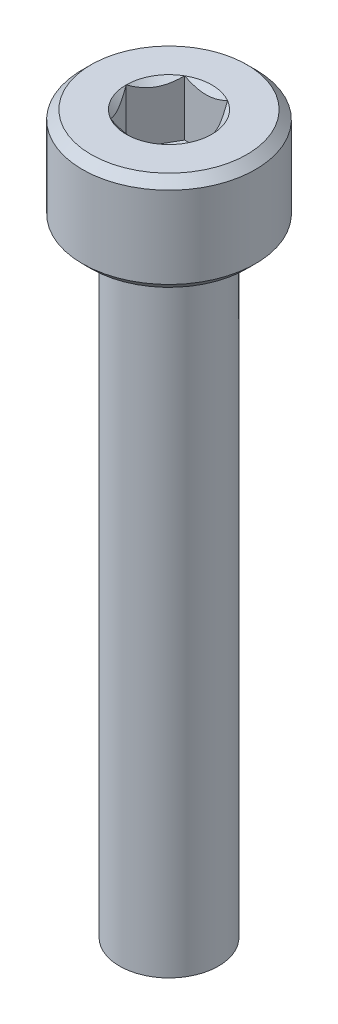
ISO-10303-21;
HEADER;
FILE_DESCRIPTION(('STEP AP214'),'2;1');
FILE_NAME('part.step','',(''),(''),'','','');
FILE_SCHEMA(('AUTOMOTIVE_DESIGN { 1 0 10303 214 1 1 1 1 }'));
ENDSEC;
DATA;
#1=APPLICATION_CONTEXT('core data for automotive mechanical design processes');
#2=APPLICATION_PROTOCOL_DEFINITION('international standard','automotive_design',2000,#1);
#3=PRODUCT_CONTEXT('',#1,'mechanical');
#4=PRODUCT('Part','Part','',(#3));
#5=PRODUCT_RELATED_PRODUCT_CATEGORY('part','',(#4));
#6=PRODUCT_DEFINITION_FORMATION('','',#4);
#7=PRODUCT_DEFINITION_CONTEXT('part definition',#1,'design');
#8=PRODUCT_DEFINITION('design','',#6,#7);
#9=PRODUCT_DEFINITION_SHAPE('','',#8);
#10=(LENGTH_UNIT() NAMED_UNIT(*) SI_UNIT(.MILLI.,.METRE.));
#11=(NAMED_UNIT(*) PLANE_ANGLE_UNIT() SI_UNIT($,.RADIAN.));
#12=(NAMED_UNIT(*) SI_UNIT($,.STERADIAN.) SOLID_ANGLE_UNIT());
#13=UNCERTAINTY_MEASURE_WITH_UNIT(LENGTH_MEASURE(1.E-05),#10,'distance_accuracy_value','');
#14=(GEOMETRIC_REPRESENTATION_CONTEXT(3) GLOBAL_UNCERTAINTY_ASSIGNED_CONTEXT((#13)) GLOBAL_UNIT_ASSIGNED_CONTEXT((#10,
#11,#12)) REPRESENTATION_CONTEXT('',''));
#15=CARTESIAN_POINT('',(0.,0.,0.));
#16=DIRECTION('',(0.,0.,1.));
#17=DIRECTION('',(1.,0.,0.));
#18=AXIS2_PLACEMENT_3D('',#15,#16,#17);
#19=CARTESIAN_POINT('',(0.,4.,0.));
#20=DIRECTION('',(0.,-1.,0.));
#21=DIRECTION('',(0.,0.,-1.));
#22=AXIS2_PLACEMENT_3D('',#19,#20,#21);
#23=CYLINDRICAL_SURFACE('',#22,3.5);
#24=CARTESIAN_POINT('',(0.,0.350000000000001,0.));
#25=DIRECTION('',(0.,1.,0.));
#26=DIRECTION('',(0.,0.,1.));
#27=AXIS2_PLACEMENT_3D('',#24,#25,#26);
#28=CIRCLE('',#27,3.5);
#29=CARTESIAN_POINT('',(0.,0.350000000000001,3.5));
#30=VERTEX_POINT('',#29);
#31=EDGE_CURVE('E227',#30,#30,#28,.T.);
#32=ORIENTED_EDGE('',*,*,#31,.T.);
#33=EDGE_LOOP('',(#32));
#34=FACE_BOUND('',#33,.T.);
#35=CARTESIAN_POINT('',(0.,3.65,0.));
#36=DIRECTION('',(0.,1.,0.));
#37=DIRECTION('',(0.,0.,1.));
#38=AXIS2_PLACEMENT_3D('',#35,#36,#37);
#39=CIRCLE('',#38,3.5);
#40=CARTESIAN_POINT('',(0.,3.65,3.5));
#41=VERTEX_POINT('',#40);
#42=EDGE_CURVE('E104',#41,#41,#39,.F.);
#43=ORIENTED_EDGE('',*,*,#42,.T.);
#44=EDGE_LOOP('',(#43));
#45=FACE_BOUND('',#44,.T.);
#46=ADVANCED_FACE('F32',(#34,#45),#23,.T.);
#47=CARTESIAN_POINT('',(0.,4.,0.));
#48=DIRECTION('',(0.,1.,0.));
#49=DIRECTION('',(0.,0.,1.));
#50=AXIS2_PLACEMENT_3D('',#47,#48,#49);
#51=PLANE('',#50);
#52=CARTESIAN_POINT('',(0.,4.,0.));
#53=DIRECTION('',(0.,1.,0.));
#54=DIRECTION('',(0.,0.,1.));
#55=AXIS2_PLACEMENT_3D('',#52,#53,#54);
#56=CIRCLE('',#55,3.15);
#57=CARTESIAN_POINT('',(0.,4.,3.15));
#58=VERTEX_POINT('',#57);
#59=EDGE_CURVE('E36',#58,#58,#56,.T.);
#60=ORIENTED_EDGE('',*,*,#59,.T.);
#61=EDGE_LOOP('',(#60));
#62=FACE_BOUND('',#61,.T.);
#63=CARTESIAN_POINT('',(0.,4.,0.));
#64=DIRECTION('',(0.,1.,0.));
#65=DIRECTION('',(0.,0.,1.));
#66=AXIS2_PLACEMENT_3D('',#63,#64,#65);
#67=CIRCLE('',#66,1.73205080756888);
#68=CARTESIAN_POINT('',(0.866025403784438,4.,1.5));
#69=VERTEX_POINT('',#68);
#70=CARTESIAN_POINT('',(1.73205080756888,4.,0.));
#71=VERTEX_POINT('',#70);
#72=EDGE_CURVE('E47',#69,#71,#67,.T.);
#73=ORIENTED_EDGE('',*,*,#72,.F.);
#74=CARTESIAN_POINT('',(-0.866025403784438,4.,1.5));
#75=VERTEX_POINT('',#74);
#76=EDGE_CURVE('E54',#75,#69,#67,.T.);
#77=ORIENTED_EDGE('',*,*,#76,.F.);
#78=CARTESIAN_POINT('',(-1.73205080756888,4.,0.));
#79=VERTEX_POINT('',#78);
#80=EDGE_CURVE('E127',#79,#75,#67,.T.);
#81=ORIENTED_EDGE('',*,*,#80,.F.);
#82=CARTESIAN_POINT('',(-0.866025403784439,4.,-1.5));
#83=VERTEX_POINT('',#82);
#84=EDGE_CURVE('E126',#83,#79,#67,.T.);
#85=ORIENTED_EDGE('',*,*,#84,.F.);
#86=CARTESIAN_POINT('',(0.866025403784438,4.,-1.5));
#87=VERTEX_POINT('',#86);
#88=EDGE_CURVE('E94',#87,#83,#67,.T.);
#89=ORIENTED_EDGE('',*,*,#88,.F.);
#90=EDGE_CURVE('E86',#71,#87,#67,.T.);
#91=ORIENTED_EDGE('',*,*,#90,.F.);
#92=EDGE_LOOP('',(#73,#77,#81,#85,#89,#91));
#93=FACE_BOUND('',#92,.T.);
#94=ADVANCED_FACE('F124',(#62,#93),#51,.T.);
#95=CARTESIAN_POINT('',(0.,0.,0.));
#96=DIRECTION('',(0.,1.,0.));
#97=DIRECTION('',(0.,0.,1.));
#98=AXIS2_PLACEMENT_3D('',#95,#96,#97);
#99=PLANE('',#98);
#100=CARTESIAN_POINT('',(0.,0.,0.));
#101=DIRECTION('',(0.,-1.,0.));
#102=DIRECTION('',(0.,0.,-1.));
#103=AXIS2_PLACEMENT_3D('',#100,#101,#102);
#104=CIRCLE('',#103,2.);
#105=CARTESIAN_POINT('',(0.,0.,-2.));
#106=VERTEX_POINT('',#105);
#107=EDGE_CURVE('E11',#106,#106,#104,.T.);
#108=ORIENTED_EDGE('',*,*,#107,.F.);
#109=EDGE_LOOP('',(#108));
#110=FACE_BOUND('',#109,.T.);
#111=CARTESIAN_POINT('',(0.,0.,0.));
#112=DIRECTION('',(0.,1.,0.));
#113=DIRECTION('',(0.,0.,1.));
#114=AXIS2_PLACEMENT_3D('',#111,#112,#113);
#115=CIRCLE('',#114,3.15);
#116=CARTESIAN_POINT('',(0.,0.,3.15));
#117=VERTEX_POINT('',#116);
#118=EDGE_CURVE('E225',#117,#117,#115,.F.);
#119=ORIENTED_EDGE('',*,*,#118,.T.);
#120=EDGE_LOOP('',(#119));
#121=FACE_BOUND('',#120,.T.);
#122=ADVANCED_FACE('F208',(#110,#121),#99,.F.);
#123=CARTESIAN_POINT('',(0.,4.,0.));
#124=DIRECTION('',(0.,1.,0.));
#125=DIRECTION('',(0.,0.,1.));
#126=AXIS2_PLACEMENT_3D('',#123,#124,#125);
#127=CONICAL_SURFACE('',#126,1.73205080756888,0.78539816339745);
#128=ORIENTED_EDGE('',*,*,#88,.T.);
#129=CARTESIAN_POINT('',(-1.72720812969692,4.55557851627079,-1.5));
#130=CARTESIAN_POINT('',(-1.68515175699268,4.52382990785743,-1.5));
#131=CARTESIAN_POINT('',(-1.64286104748673,4.49239259380738,-1.5));
#132=CARTESIAN_POINT('',(-1.55771581035942,4.43026908755641,-1.5));
#133=CARTESIAN_POINT('',(-1.51486114386668,4.3995830858922,-1.5));
#134=CARTESIAN_POINT('',(-1.3846813415127,4.30840719242716,-1.5));
#135=CARTESIAN_POINT('',(-1.29637976071654,4.24928834342677,-1.5));
#136=CARTESIAN_POINT('',(-1.11121478730467,4.1332309963165,-1.5));
#137=CARTESIAN_POINT('',(-1.01415038238167,4.07660955873301,-1.5));
#138=CARTESIAN_POINT('',(-0.815173408897606,3.97303688126565,-1.5));
#139=CARTESIAN_POINT('',(-0.713278669253285,3.92605304154167,-1.5));
#140=CARTESIAN_POINT('',(-0.560333774943112,3.86857266843083,-1.5));
#141=CARTESIAN_POINT('',(-0.511547982948042,3.85207538775725,-1.5));
#142=CARTESIAN_POINT('',(-0.412798620136866,3.822997512927,-1.5));
#143=CARTESIAN_POINT('',(-0.362834968437563,3.81041718859402,-1.5));
#144=CARTESIAN_POINT('',(-0.262863235444982,3.79003619414677,-1.5));
#145=CARTESIAN_POINT('',(-0.212872113808023,3.78215363274598,-1.5));
#146=CARTESIAN_POINT('',(-0.112355243569545,3.771322063969,-1.5));
#147=CARTESIAN_POINT('',(-0.0618295883726279,3.76837220852435,-1.5));
#148=CARTESIAN_POINT('',(0.037429173332384,3.76762485772485,-1.5));
#149=CARTESIAN_POINT('',(0.0861609672002989,3.76964473355808,-1.5));
#150=CARTESIAN_POINT('',(0.183206937768827,3.77832255289676,-1.5));
#151=CARTESIAN_POINT('',(0.231521073438269,3.78498094696846,-1.5));
#152=CARTESIAN_POINT('',(0.328199853425436,3.80268524412257,-1.5));
#153=CARTESIAN_POINT('',(0.376550616310328,3.81380581125704,-1.5));
#154=CARTESIAN_POINT('',(0.472195697125598,3.83984341404871,-1.5));
#155=CARTESIAN_POINT('',(0.51949010309274,3.85476013204094,-1.5));
#156=CARTESIAN_POINT('',(0.668391282696624,3.90733522359607,-1.5));
#157=CARTESIAN_POINT('',(0.767878709508552,3.95098128747198,-1.5));
#158=CARTESIAN_POINT('',(0.962179866690724,4.0480229945931,-1.5));
#159=CARTESIAN_POINT('',(1.05697519961444,4.10145366508953,-1.5));
#160=CARTESIAN_POINT('',(1.23814273533383,4.21168585200456,-1.5));
#161=CARTESIAN_POINT('',(1.3246994218129,4.2681879206986,-1.5));
#162=CARTESIAN_POINT('',(1.45222331290673,4.35553430157866,-1.5));
#163=CARTESIAN_POINT('',(1.49418091978756,4.38495775868004,-1.5));
#164=CARTESIAN_POINT('',(1.57752272931476,4.44458282183046,-1.5));
#165=CARTESIAN_POINT('',(1.61890708647354,4.47478421166444,-1.5));
#166=CARTESIAN_POINT('',(1.66005278019494,4.50530817860946,-1.5));
#167=B_SPLINE_CURVE_WITH_KNOTS('',3,(#129,#130,#131,#132,#133,#134,#135,#136,#137,#138,#139,
#140,#141,#142,#143,#144,#145,#146,#147,#148,#149,#150,#151,#152,#153,#154,#155,#156,#157,#158,
#159,#160,#161,#162,#163,#164,#165,#166),.UNSPECIFIED.,.F.,.F.,(4,2,2,2,2,2,2,2,2,2,2,2,2,2,2,2,
2,2,4),(0.,0.158079548982669,0.316198780993942,0.634850417346958,0.971690311361509,
1.30737131660667,1.46173961127089,1.61611853740677,1.76772101421409,1.91929742368538,
2.065387412096,2.21149159305544,2.36014984633872,2.50879566386709,2.83376031422673,
3.15991186985652,3.46985601802197,3.62358896039974,3.7772796264207),.UNSPECIFIED.);
#168=EDGE_CURVE('E99',#87,#83,#167,.F.);
#169=ORIENTED_EDGE('',*,*,#168,.F.);
#170=EDGE_LOOP('',(#128,#169));
#171=FACE_BOUND('',#170,.T.);
#172=ADVANCED_FACE('F100',(#171),#127,.F.);
#173=ORIENTED_EDGE('',*,*,#84,.T.);
#174=CARTESIAN_POINT('',(-0.865909933730601,4.00011548160007,-1.5002));
#175=CARTESIAN_POINT('',(-0.895682611594166,3.97036547606733,-1.44863220926292));
#176=CARTESIAN_POINT('',(-0.925953159489765,3.94236248391031,-1.3962020823348));
#177=CARTESIAN_POINT('',(-0.987678321317123,3.89108923044014,-1.2892909659444));
#178=CARTESIAN_POINT('',(-1.01913880822717,3.86784750504437,-1.23479980418534));
#179=CARTESIAN_POINT('',(-1.08257741237344,3.82803372899222,-1.12492091864275));
#180=CARTESIAN_POINT('',(-1.11453936608521,3.8113615856709,-1.0695611909048));
#181=CARTESIAN_POINT('',(-1.1791670593912,3.7856744568181,-0.957622742522849));
#182=CARTESIAN_POINT('',(-1.21183082354213,3.77664029047887,-0.901047443446992));
#183=CARTESIAN_POINT('',(-1.26812411040032,3.76848908122685,-0.803544610483559));
#184=CARTESIAN_POINT('',(-1.29168087824208,3.76728225298922,-0.762743091719534));
#185=CARTESIAN_POINT('',(-1.33875285845138,3.76931405716227,-0.681212030384142));
#186=CARTESIAN_POINT('',(-1.36226806050018,3.77255367074831,-0.64048250568537));
#187=CARTESIAN_POINT('',(-1.40907206156905,3.78329198598196,-0.559415597836584));
#188=CARTESIAN_POINT('',(-1.43236062923612,3.79079465301873,-0.519078615401712));
#189=CARTESIAN_POINT('',(-1.47854689118996,3.80965161192829,-0.439081663085969));
#190=CARTESIAN_POINT('',(-1.50144441326545,3.82100755701858,-0.399421991483792));
#191=CARTESIAN_POINT('',(-1.56009461325633,3.85472164759267,-0.297836865225515));
#192=CARTESIAN_POINT('',(-1.59548353987866,3.87962184909337,-0.236541446290311));
#193=CARTESIAN_POINT('',(-1.64751843074894,3.92165665327158,-0.146414371536686));
#194=CARTESIAN_POINT('',(-1.66466545167617,3.9364251535591,-0.116714860092282));
#195=CARTESIAN_POINT('',(-1.69864410935691,3.96731056594017,-0.0578620986162487));
#196=CARTESIAN_POINT('',(-1.71547589206761,3.98342683412171,-0.0287085957793624));
#197=CARTESIAN_POINT('',(-1.73216627762272,4.00011548160007,0.00020000000000028));
#198=B_SPLINE_CURVE_WITH_KNOTS('',3,(#174,#175,#176,#177,#178,#179,#180,#181,#182,#183,#184,
#185,#186,#187,#188,#189,#190,#191,#192,#193,#194,#195,#196,#197),.UNSPECIFIED.,.F.,.F.,(4,2,2,
2,2,2,2,2,2,2,2,4),(0.,0.199829143693304,0.400822987382388,0.598623720538181,0.795926240188889,
0.937113067959881,1.07833105577193,1.21968061668222,1.36109089931054,1.58570969637565,
1.69770705470964,1.80965120737194),.UNSPECIFIED.);
#199=EDGE_CURVE('E129',#83,#79,#198,.T.);
#200=ORIENTED_EDGE('',*,*,#199,.F.);
#201=EDGE_LOOP('',(#173,#200));
#202=FACE_BOUND('',#201,.T.);
#203=ADVANCED_FACE('F240',(#202),#127,.F.);
#204=ORIENTED_EDGE('',*,*,#80,.T.);
#205=CARTESIAN_POINT('',(-1.73216627762272,4.00011548160007,-0.000199999999999694));
#206=CARTESIAN_POINT('',(-1.70239359975915,3.97036547606733,0.051367790737076));
#207=CARTESIAN_POINT('',(-1.67212305186355,3.94236248391031,0.103797917665201));
#208=CARTESIAN_POINT('',(-1.61039789003619,3.89108923044014,0.210709034055597));
#209=CARTESIAN_POINT('',(-1.57893740312614,3.86784750504437,0.265200195814662));
#210=CARTESIAN_POINT('',(-1.51549879897987,3.82803372899222,0.375079081357249));
#211=CARTESIAN_POINT('',(-1.4835368452681,3.8113615856709,0.4304388090952));
#212=CARTESIAN_POINT('',(-1.41890915196211,3.7856744568181,0.542377257477151));
#213=CARTESIAN_POINT('',(-1.38624538781118,3.77664029047887,0.598952556553009));
#214=CARTESIAN_POINT('',(-1.32995210095299,3.76848908122685,0.696455389516441));
#215=CARTESIAN_POINT('',(-1.30639533311124,3.76728225298922,0.737256908280466));
#216=CARTESIAN_POINT('',(-1.25932335290193,3.76931405716227,0.818787969615858));
#217=CARTESIAN_POINT('',(-1.23580815085313,3.77255367074831,0.85951749431463));
#218=CARTESIAN_POINT('',(-1.18900414978427,3.78329198598196,0.940584402163416));
#219=CARTESIAN_POINT('',(-1.1657155821172,3.79079465301873,0.980921384598288));
#220=CARTESIAN_POINT('',(-1.11952932016335,3.80965161192829,1.06091833691403));
#221=CARTESIAN_POINT('',(-1.09663179808786,3.82100755701859,1.10057800851621));
#222=CARTESIAN_POINT('',(-1.03798159809698,3.85472164759267,1.20216313477448));
#223=CARTESIAN_POINT('',(-1.00259267147465,3.87962184909337,1.26345855370969));
#224=CARTESIAN_POINT('',(-0.950557780604375,3.92165665327158,1.35358562846331));
#225=CARTESIAN_POINT('',(-0.933410759677147,3.9364251535591,1.38328513990772));
#226=CARTESIAN_POINT('',(-0.899432101996407,3.96731056594017,1.44213790138375));
#227=CARTESIAN_POINT('',(-0.88260031928571,3.98342683412171,1.47129140422064));
#228=CARTESIAN_POINT('',(-0.865909933730601,4.00011548160007,1.5002));
#229=B_SPLINE_CURVE_WITH_KNOTS('',3,(#205,#206,#207,#208,#209,#210,#211,#212,#213,#214,#215,
#216,#217,#218,#219,#220,#221,#222,#223,#224,#225,#226,#227,#228),.UNSPECIFIED.,.F.,.F.,(4,2,2,
2,2,2,2,2,2,2,2,4),(0.,0.199829143693305,0.400822987382389,0.598623720538181,0.795926240188889,
0.937113067959881,1.07833105577193,1.21968061668222,1.36109089931054,1.58570969637565,
1.69770705470964,1.80965120737194),.UNSPECIFIED.);
#230=EDGE_CURVE('E139',#79,#75,#229,.T.);
#231=ORIENTED_EDGE('',*,*,#230,.F.);
#232=EDGE_LOOP('',(#204,#231));
#233=FACE_BOUND('',#232,.T.);
#234=ADVANCED_FACE('F256',(#233),#127,.F.);
#235=ORIENTED_EDGE('',*,*,#76,.T.);
#236=CARTESIAN_POINT('',(-1.72720812994822,4.55557851646053,1.5));
#237=CARTESIAN_POINT('',(-1.68515175723693,4.52382990803985,1.5));
#238=CARTESIAN_POINT('',(-1.64286104772391,4.49239259398251,1.5));
#239=CARTESIAN_POINT('',(-1.55771581058238,4.43026908771699,1.5));
#240=CARTESIAN_POINT('',(-1.51486114408249,4.39958308604553,1.5));
#241=CARTESIAN_POINT('',(-1.38468134170665,4.30840719255859,1.5));
#242=CARTESIAN_POINT('',(-1.29637976089561,4.24928834354366,1.5));
#243=CARTESIAN_POINT('',(-1.11121478745132,4.13323099640349,1.5));
#244=CARTESIAN_POINT('',(-1.01415038251067,4.07660955880473,1.5));
#245=CARTESIAN_POINT('',(-0.815173408989814,3.9730368813091,1.5));
#246=CARTESIAN_POINT('',(-0.71327866932636,3.92605304157206,1.5));
#247=CARTESIAN_POINT('',(-0.56033377500179,3.86857266845154,1.5));
#248=CARTESIAN_POINT('',(-0.511547983012749,3.85207538777834,1.5));
#249=CARTESIAN_POINT('',(-0.412798620213828,3.82299751294763,1.5));
#250=CARTESIAN_POINT('',(-0.362834968520751,3.8104171886138,1.5));
#251=CARTESIAN_POINT('',(-0.262863235540417,3.79003619416346,1.5));
#252=CARTESIAN_POINT('',(-0.212872113909475,3.78215363276045,1.5));
#253=CARTESIAN_POINT('',(-0.112355243682832,3.77132206397768,1.5));
#254=CARTESIAN_POINT('',(-0.061829588491731,3.76837220852945,1.5));
#255=CARTESIAN_POINT('',(0.0374291732025493,3.76762485772178,1.5));
#256=CARTESIAN_POINT('',(0.086160967065534,3.76964473355048,1.5));
#257=CARTESIAN_POINT('',(0.183206937624695,3.77832255287941,1.5));
#258=CARTESIAN_POINT('',(0.2315210732897,3.78498094694588,1.5));
#259=CARTESIAN_POINT('',(0.328199853268108,3.80268524408904,1.5));
#260=CARTESIAN_POINT('',(0.376550616148692,3.81380581121775,1.5));
#261=CARTESIAN_POINT('',(0.47219569695576,3.83984341399777,1.5));
#262=CARTESIAN_POINT('',(0.51949010291901,3.8547601319841,1.5));
#263=CARTESIAN_POINT('',(0.668391282485064,3.90733522351148,1.5));
#264=CARTESIAN_POINT('',(0.767878709264951,3.95098128736184,1.5));
#265=CARTESIAN_POINT('',(0.9621798663855,4.04802299442906,1.5));
#266=CARTESIAN_POINT('',(1.05697519927965,4.10145366489712,1.5));
#267=CARTESIAN_POINT('',(1.23814273494588,4.21168585175783,1.5));
#268=CARTESIAN_POINT('',(1.32469942140117,4.26818792042618,1.5));
#269=CARTESIAN_POINT('',(1.45222331245985,4.35553430126784,1.5));
#270=CARTESIAN_POINT('',(1.49418091932912,4.38495775835653,1.5));
#271=CARTESIAN_POINT('',(1.5775227288333,4.44458282148157,1.5));
#272=CARTESIAN_POINT('',(1.6189070859806,4.47478421130286,1.5));
#273=CARTESIAN_POINT('',(1.66005277969054,4.50530817823521,1.5));
#274=B_SPLINE_CURVE_WITH_KNOTS('',3,(#236,#237,#238,#239,#240,#241,#242,#243,#244,#245,#246,
#247,#248,#249,#250,#251,#252,#253,#254,#255,#256,#257,#258,#259,#260,#261,#262,#263,#264,#265,
#266,#267,#268,#269,#270,#271,#272,#273),.UNSPECIFIED.,.F.,.F.,(4,2,2,2,2,2,2,2,2,2,2,2,2,2,2,2,
2,2,4),(0.,0.158079549012757,0.316198781054129,0.634850417468465,0.971690311551782,
1.30737131686505,1.46173961151184,1.61611853763032,1.76772101442095,1.91929742387554,
2.06538741227089,2.21149159321503,2.36014984648185,2.50879566399376,2.83376031423511,
3.15991186974582,3.4698560178094,3.62358896013692,3.77727962610764),.UNSPECIFIED.);
#275=EDGE_CURVE('E168',#75,#69,#274,.T.);
#276=ORIENTED_EDGE('',*,*,#275,.F.);
#277=EDGE_LOOP('',(#235,#276));
#278=FACE_BOUND('',#277,.T.);
#279=ADVANCED_FACE('F286',(#278),#127,.F.);
#280=ORIENTED_EDGE('',*,*,#72,.T.);
#281=CARTESIAN_POINT('',(0.865909933730601,4.00011548160007,1.5002));
#282=CARTESIAN_POINT('',(0.895682611594166,3.97036547606733,1.44863220926292));
#283=CARTESIAN_POINT('',(0.925953159489765,3.94236248391031,1.3962020823348));
#284=CARTESIAN_POINT('',(0.987678321317124,3.89108923044014,1.2892909659444));
#285=CARTESIAN_POINT('',(1.01913880822717,3.86784750504437,1.23479980418534));
#286=CARTESIAN_POINT('',(1.08257741237344,3.82803372899222,1.12492091864275));
#287=CARTESIAN_POINT('',(1.11453936608521,3.8113615856709,1.0695611909048));
#288=CARTESIAN_POINT('',(1.1791670593912,3.7856744568181,0.95762274252285));
#289=CARTESIAN_POINT('',(1.21183082354213,3.77664029047887,0.901047443446992));
#290=CARTESIAN_POINT('',(1.26812411040032,3.76848908122685,0.80354461048356));
#291=CARTESIAN_POINT('',(1.29168087824208,3.76728225298922,0.762743091719534));
#292=CARTESIAN_POINT('',(1.33875285845138,3.76931405716227,0.681212030384142));
#293=CARTESIAN_POINT('',(1.36226806050018,3.77255367074831,0.640482505685371));
#294=CARTESIAN_POINT('',(1.40907206156905,3.78329198598196,0.559415597836584));
#295=CARTESIAN_POINT('',(1.43236062923612,3.79079465301873,0.519078615401712));
#296=CARTESIAN_POINT('',(1.47854689118996,3.80965161192829,0.43908166308597));
#297=CARTESIAN_POINT('',(1.50144441326545,3.82100755701859,0.399421991483792));
#298=CARTESIAN_POINT('',(1.56009461325633,3.85472164759267,0.297836865225515));
#299=CARTESIAN_POINT('',(1.59548353987866,3.87962184909337,0.236541446290311));
#300=CARTESIAN_POINT('',(1.64751843074894,3.92165665327158,0.146414371536686));
#301=CARTESIAN_POINT('',(1.66466545167617,3.9364251535591,0.116714860092282));
#302=CARTESIAN_POINT('',(1.69864410935691,3.96731056594017,0.0578620986162488));
#303=CARTESIAN_POINT('',(1.71547589206761,3.98342683412171,0.0287085957793626));
#304=CARTESIAN_POINT('',(1.73216627762272,4.00011548160007,-0.000200000000000026));
#305=B_SPLINE_CURVE_WITH_KNOTS('',3,(#281,#282,#283,#284,#285,#286,#287,#288,#289,#290,#291,
#292,#293,#294,#295,#296,#297,#298,#299,#300,#301,#302,#303,#304),.UNSPECIFIED.,.F.,.F.,(4,2,2,
2,2,2,2,2,2,2,2,4),(0.,0.199829143693305,0.400822987382389,0.59862372053818,0.795926240188889,
0.937113067959881,1.07833105577193,1.21968061668222,1.36109089931054,1.58570969637565,
1.69770705470964,1.80965120737194),.UNSPECIFIED.);
#306=EDGE_CURVE('E114',#69,#71,#305,.T.);
#307=ORIENTED_EDGE('',*,*,#306,.F.);
#308=EDGE_LOOP('',(#280,#307));
#309=FACE_BOUND('',#308,.T.);
#310=ADVANCED_FACE('F154',(#309),#127,.F.);
#311=ORIENTED_EDGE('',*,*,#90,.T.);
#312=CARTESIAN_POINT('',(1.73216627762272,4.00011548160007,0.000200000000000282));
#313=CARTESIAN_POINT('',(1.70239359975915,3.97036547606733,-0.0513677907370753));
#314=CARTESIAN_POINT('',(1.67212305186355,3.94236248391031,-0.103797917665201));
#315=CARTESIAN_POINT('',(1.61039789003619,3.89108923044014,-0.210709034055596));
#316=CARTESIAN_POINT('',(1.57893740312614,3.86784750504437,-0.265200195814661));
#317=CARTESIAN_POINT('',(1.51549879897987,3.82803372899222,-0.375079081357248));
#318=CARTESIAN_POINT('',(1.4835368452681,3.8113615856709,-0.430438809095199));
#319=CARTESIAN_POINT('',(1.41890915196211,3.7856744568181,-0.54237725747715));
#320=CARTESIAN_POINT('',(1.38624538781118,3.77664029047887,-0.598952556553008));
#321=CARTESIAN_POINT('',(1.32995210095299,3.76848908122685,-0.69645538951644));
#322=CARTESIAN_POINT('',(1.30639533311124,3.76728225298922,-0.737256908280466));
#323=CARTESIAN_POINT('',(1.25932335290193,3.76931405716227,-0.818787969615858));
#324=CARTESIAN_POINT('',(1.23580815085313,3.77255367074831,-0.85951749431463));
#325=CARTESIAN_POINT('',(1.18900414978427,3.78329198598196,-0.940584402163416));
#326=CARTESIAN_POINT('',(1.1657155821172,3.79079465301873,-0.980921384598288));
#327=CARTESIAN_POINT('',(1.11952932016335,3.80965161192829,-1.06091833691403));
#328=CARTESIAN_POINT('',(1.09663179808786,3.82100755701858,-1.10057800851621));
#329=CARTESIAN_POINT('',(1.03798159809698,3.85472164759267,-1.20216313477448));
#330=CARTESIAN_POINT('',(1.00259267147465,3.87962184909337,-1.26345855370969));
#331=CARTESIAN_POINT('',(0.950557780604375,3.92165665327158,-1.35358562846331));
#332=CARTESIAN_POINT('',(0.933410759677148,3.9364251535591,-1.38328513990772));
#333=CARTESIAN_POINT('',(0.899432101996407,3.96731056594017,-1.44213790138375));
#334=CARTESIAN_POINT('',(0.88260031928571,3.98342683412171,-1.47129140422064));
#335=CARTESIAN_POINT('',(0.865909933730601,4.00011548160007,-1.5002));
#336=B_SPLINE_CURVE_WITH_KNOTS('',3,(#312,#313,#314,#315,#316,#317,#318,#319,#320,#321,#322,
#323,#324,#325,#326,#327,#328,#329,#330,#331,#332,#333,#334,#335),.UNSPECIFIED.,.F.,.F.,(4,2,2,
2,2,2,2,2,2,2,2,4),(0.,0.199829143693305,0.400822987382389,0.598623720538181,0.79592624018889,
0.937113067959881,1.07833105577193,1.21968061668222,1.36109089931054,1.58570969637566,
1.69770705470964,1.80965120737194),.UNSPECIFIED.);
#337=EDGE_CURVE('E90',#71,#87,#336,.T.);
#338=ORIENTED_EDGE('',*,*,#337,.F.);
#339=EDGE_LOOP('',(#311,#338));
#340=FACE_BOUND('',#339,.T.);
#341=ADVANCED_FACE('F88',(#340),#127,.F.);
#342=CARTESIAN_POINT('',(0.,1.75,0.));
#343=DIRECTION('',(0.,1.,0.));
#344=DIRECTION('',(0.,0.,1.));
#345=AXIS2_PLACEMENT_3D('',#342,#343,#344);
#346=PLANE('',#345);
#347=DIRECTION('',(-0.5,0.,-0.866025403784439));
#348=VECTOR('',#347,1.);
#349=CARTESIAN_POINT('',(1.73205080756888,1.75,0.));
#350=LINE('',#349,#348);
#351=CARTESIAN_POINT('',(1.73205080756888,1.75,0.));
#352=VERTEX_POINT('',#351);
#353=CARTESIAN_POINT('',(0.866025403784438,1.75,-1.5));
#354=VERTEX_POINT('',#353);
#355=EDGE_CURVE('E113',#352,#354,#350,.T.);
#356=ORIENTED_EDGE('',*,*,#355,.T.);
#357=DIRECTION('',(-1.,0.,0.));
#358=VECTOR('',#357,1.);
#359=CARTESIAN_POINT('',(0.866025403784438,1.75,-1.5));
#360=LINE('',#359,#358);
#361=CARTESIAN_POINT('',(-0.866025403784439,1.75,-1.5));
#362=VERTEX_POINT('',#361);
#363=EDGE_CURVE('E118',#354,#362,#360,.T.);
#364=ORIENTED_EDGE('',*,*,#363,.T.);
#365=DIRECTION('',(-0.5,0.,0.866025403784439));
#366=VECTOR('',#365,1.);
#367=CARTESIAN_POINT('',(-0.866025403784439,1.75,-1.5));
#368=LINE('',#367,#366);
#369=CARTESIAN_POINT('',(-1.73205080756888,1.75,0.));
#370=VERTEX_POINT('',#369);
#371=EDGE_CURVE('E280',#362,#370,#368,.T.);
#372=ORIENTED_EDGE('',*,*,#371,.T.);
#373=DIRECTION('',(0.5,0.,0.866025403784439));
#374=VECTOR('',#373,1.);
#375=CARTESIAN_POINT('',(-1.73205080756888,1.75,0.));
#376=LINE('',#375,#374);
#377=CARTESIAN_POINT('',(-0.866025403784438,1.75,1.5));
#378=VERTEX_POINT('',#377);
#379=EDGE_CURVE('E263',#370,#378,#376,.T.);
#380=ORIENTED_EDGE('',*,*,#379,.T.);
#381=DIRECTION('',(1.,0.,0.));
#382=VECTOR('',#381,1.);
#383=CARTESIAN_POINT('',(-0.866025403784438,1.75,1.5));
#384=LINE('',#383,#382);
#385=CARTESIAN_POINT('',(0.866025403784439,1.75,1.5));
#386=VERTEX_POINT('',#385);
#387=EDGE_CURVE('E276',#378,#386,#384,.T.);
#388=ORIENTED_EDGE('',*,*,#387,.T.);
#389=DIRECTION('',(0.5,0.,-0.866025403784439));
#390=VECTOR('',#389,1.);
#391=CARTESIAN_POINT('',(0.866025403784439,1.75,1.5));
#392=LINE('',#391,#390);
#393=EDGE_CURVE('E121',#386,#352,#392,.T.);
#394=ORIENTED_EDGE('',*,*,#393,.T.);
#395=EDGE_LOOP('',(#356,#364,#372,#380,#388,#394));
#396=FACE_BOUND('',#395,.T.);
#397=ADVANCED_FACE('F153',(#396),#346,.T.);
#398=CARTESIAN_POINT('',(0.866025403784438,1.75,-1.5));
#399=DIRECTION('',(0.,0.,-1.));
#400=DIRECTION('',(-1.,0.,0.));
#401=AXIS2_PLACEMENT_3D('',#398,#399,#400);
#402=PLANE('',#401);
#403=DIRECTION('',(0.,1.,0.));
#404=VECTOR('',#403,1.);
#405=CARTESIAN_POINT('',(0.866025403784438,1.75,-1.5));
#406=LINE('',#405,#404);
#407=EDGE_CURVE('E111',#354,#87,#406,.T.);
#408=ORIENTED_EDGE('',*,*,#407,.T.);
#409=ORIENTED_EDGE('',*,*,#168,.T.);
#410=DIRECTION('',(0.,1.,0.));
#411=VECTOR('',#410,1.);
#412=CARTESIAN_POINT('',(-0.866025403784439,1.75,-1.5));
#413=LINE('',#412,#411);
#414=EDGE_CURVE('E120',#362,#83,#413,.T.);
#415=ORIENTED_EDGE('',*,*,#414,.F.);
#416=ORIENTED_EDGE('',*,*,#363,.F.);
#417=EDGE_LOOP('',(#408,#409,#415,#416));
#418=FACE_BOUND('',#417,.T.);
#419=ADVANCED_FACE('F116',(#418),#402,.F.);
#420=CARTESIAN_POINT('',(-0.866025403784439,1.75,-1.5));
#421=DIRECTION('',(-0.866025403784439,0.,-0.5));
#422=DIRECTION('',(-0.5,0.,0.866025403784439));
#423=AXIS2_PLACEMENT_3D('',#420,#421,#422);
#424=PLANE('',#423);
#425=ORIENTED_EDGE('',*,*,#414,.T.);
#426=ORIENTED_EDGE('',*,*,#199,.T.);
#427=DIRECTION('',(0.,1.,0.));
#428=VECTOR('',#427,1.);
#429=CARTESIAN_POINT('',(-1.73205080756888,1.75,0.));
#430=LINE('',#429,#428);
#431=EDGE_CURVE('E259',#370,#79,#430,.T.);
#432=ORIENTED_EDGE('',*,*,#431,.F.);
#433=ORIENTED_EDGE('',*,*,#371,.F.);
#434=EDGE_LOOP('',(#425,#426,#432,#433));
#435=FACE_BOUND('',#434,.T.);
#436=ADVANCED_FACE('F146',(#435),#424,.F.);
#437=CARTESIAN_POINT('',(-1.73205080756888,1.75,0.));
#438=DIRECTION('',(-0.866025403784439,0.,0.5));
#439=DIRECTION('',(0.5,0.,0.866025403784439));
#440=AXIS2_PLACEMENT_3D('',#437,#438,#439);
#441=PLANE('',#440);
#442=ORIENTED_EDGE('',*,*,#431,.T.);
#443=ORIENTED_EDGE('',*,*,#230,.T.);
#444=DIRECTION('',(0.,1.,0.));
#445=VECTOR('',#444,1.);
#446=CARTESIAN_POINT('',(-0.866025403784438,1.75,1.5));
#447=LINE('',#446,#445);
#448=EDGE_CURVE('E265',#378,#75,#447,.T.);
#449=ORIENTED_EDGE('',*,*,#448,.F.);
#450=ORIENTED_EDGE('',*,*,#379,.F.);
#451=EDGE_LOOP('',(#442,#443,#449,#450));
#452=FACE_BOUND('',#451,.T.);
#453=ADVANCED_FACE('F192',(#452),#441,.F.);
#454=CARTESIAN_POINT('',(-0.866025403784438,1.75,1.5));
#455=DIRECTION('',(0.,0.,1.));
#456=DIRECTION('',(1.,0.,0.));
#457=AXIS2_PLACEMENT_3D('',#454,#455,#456);
#458=PLANE('',#457);
#459=ORIENTED_EDGE('',*,*,#448,.T.);
#460=ORIENTED_EDGE('',*,*,#275,.T.);
#461=DIRECTION('',(0.,1.,0.));
#462=VECTOR('',#461,1.);
#463=CARTESIAN_POINT('',(0.866025403784439,1.75,1.5));
#464=LINE('',#463,#462);
#465=EDGE_CURVE('E267',#386,#69,#464,.T.);
#466=ORIENTED_EDGE('',*,*,#465,.F.);
#467=ORIENTED_EDGE('',*,*,#387,.F.);
#468=EDGE_LOOP('',(#459,#460,#466,#467));
#469=FACE_BOUND('',#468,.T.);
#470=ADVANCED_FACE('F188',(#469),#458,.F.);
#471=CARTESIAN_POINT('',(0.866025403784439,1.75,1.5));
#472=DIRECTION('',(0.866025403784439,0.,0.5));
#473=DIRECTION('',(0.5,0.,-0.866025403784439));
#474=AXIS2_PLACEMENT_3D('',#471,#472,#473);
#475=PLANE('',#474);
#476=ORIENTED_EDGE('',*,*,#465,.T.);
#477=ORIENTED_EDGE('',*,*,#306,.T.);
#478=DIRECTION('',(0.,1.,0.));
#479=VECTOR('',#478,1.);
#480=CARTESIAN_POINT('',(1.73205080756888,1.75,0.));
#481=LINE('',#480,#479);
#482=EDGE_CURVE('E105',#352,#71,#481,.T.);
#483=ORIENTED_EDGE('',*,*,#482,.F.);
#484=ORIENTED_EDGE('',*,*,#393,.F.);
#485=EDGE_LOOP('',(#476,#477,#483,#484));
#486=FACE_BOUND('',#485,.T.);
#487=ADVANCED_FACE('F185',(#486),#475,.F.);
#488=CARTESIAN_POINT('',(1.73205080756888,1.75,0.));
#489=DIRECTION('',(0.866025403784439,0.,-0.5));
#490=DIRECTION('',(-0.5,0.,-0.866025403784439));
#491=AXIS2_PLACEMENT_3D('',#488,#489,#490);
#492=PLANE('',#491);
#493=ORIENTED_EDGE('',*,*,#482,.T.);
#494=ORIENTED_EDGE('',*,*,#337,.T.);
#495=ORIENTED_EDGE('',*,*,#407,.F.);
#496=ORIENTED_EDGE('',*,*,#355,.F.);
#497=EDGE_LOOP('',(#493,#494,#495,#496));
#498=FACE_BOUND('',#497,.T.);
#499=ADVANCED_FACE('F109',(#498),#492,.F.);
#500=CARTESIAN_POINT('',(0.,0.350000000000001,0.));
#501=DIRECTION('',(0.,1.,0.));
#502=DIRECTION('',(0.,0.,1.));
#503=AXIS2_PLACEMENT_3D('',#500,#501,#502);
#504=CONICAL_SURFACE('',#503,3.5,0.78539816339745);
#505=ORIENTED_EDGE('',*,*,#118,.F.);
#506=EDGE_LOOP('',(#505));
#507=FACE_BOUND('',#506,.T.);
#508=ORIENTED_EDGE('',*,*,#31,.F.);
#509=EDGE_LOOP('',(#508));
#510=FACE_BOUND('',#509,.T.);
#511=ADVANCED_FACE('F214',(#507,#510),#504,.T.);
#512=CARTESIAN_POINT('',(0.,4.,0.));
#513=DIRECTION('',(0.,-1.,0.));
#514=DIRECTION('',(0.,0.,-1.));
#515=AXIS2_PLACEMENT_3D('',#512,#513,#514);
#516=CONICAL_SURFACE('',#515,3.15,0.785398163397448);
#517=ORIENTED_EDGE('',*,*,#42,.F.);
#518=EDGE_LOOP('',(#517));
#519=FACE_BOUND('',#518,.T.);
#520=ORIENTED_EDGE('',*,*,#59,.F.);
#521=EDGE_LOOP('',(#520));
#522=FACE_BOUND('',#521,.T.);
#523=ADVANCED_FACE('F34',(#519,#522),#516,.T.);
#524=CARTESIAN_POINT('',(0.,-25.,0.));
#525=DIRECTION('',(0.,1.,0.));
#526=DIRECTION('',(0.,0.,1.));
#527=AXIS2_PLACEMENT_3D('',#524,#525,#526);
#528=CYLINDRICAL_SURFACE('',#527,2.);
#529=CARTESIAN_POINT('',(0.,-25.,0.));
#530=DIRECTION('',(0.,-1.,0.));
#531=DIRECTION('',(0.,0.,-1.));
#532=AXIS2_PLACEMENT_3D('',#529,#530,#531);
#533=CIRCLE('',#532,2.);
#534=CARTESIAN_POINT('',(0.,-25.,-2.));
#535=VERTEX_POINT('',#534);
#536=EDGE_CURVE('E252',#535,#535,#533,.T.);
#537=ORIENTED_EDGE('',*,*,#536,.F.);
#538=EDGE_LOOP('',(#537));
#539=FACE_BOUND('',#538,.T.);
#540=ORIENTED_EDGE('',*,*,#107,.T.);
#541=EDGE_LOOP('',(#540));
#542=FACE_BOUND('',#541,.T.);
#543=ADVANCED_FACE('F155',(#539,#542),#528,.T.);
#544=CARTESIAN_POINT('',(0.,-25.,0.));
#545=DIRECTION('',(0.,-1.,0.));
#546=DIRECTION('',(0.,0.,-1.));
#547=AXIS2_PLACEMENT_3D('',#544,#545,#546);
#548=PLANE('',#547);
#549=ORIENTED_EDGE('',*,*,#536,.T.);
#550=EDGE_LOOP('',(#549));
#551=FACE_BOUND('',#550,.T.);
#552=ADVANCED_FACE('F244',(#551),#548,.T.);
#553=CLOSED_SHELL('',(#46,#94,#122,#172,#203,#234,#279,#310,#341,#397,#419,#436,#453,#470,#487,
#499,#511,#523,#543,#552));
#554=MANIFOLD_SOLID_BREP('B2',#553);
#555=ADVANCED_BREP_SHAPE_REPRESENTATION('',(#18,#554),#14);
#556=SHAPE_DEFINITION_REPRESENTATION(#9,#555);
ENDSEC;
END-ISO-10303-21;
